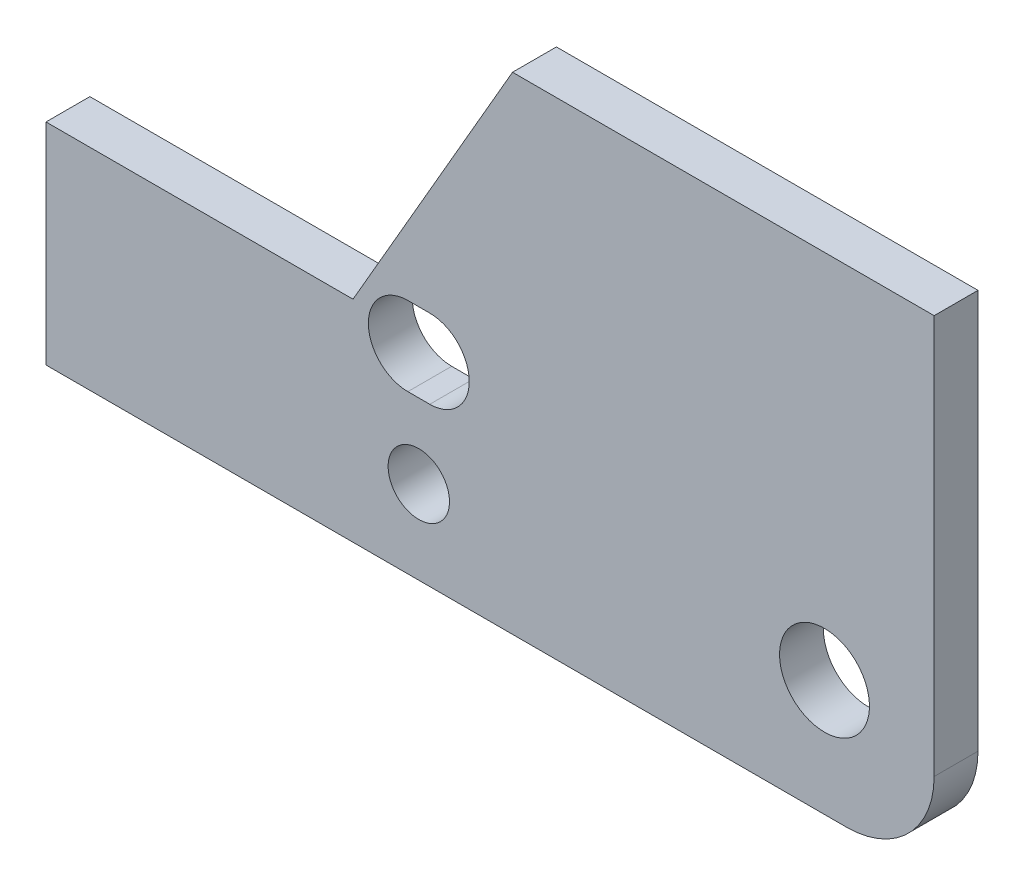
ISO-10303-21;
HEADER;
FILE_DESCRIPTION(('STEP AP214'),'2;1');
FILE_NAME('part.step','',(''),(''),'','','');
FILE_SCHEMA(('AUTOMOTIVE_DESIGN { 1 0 10303 214 1 1 1 1 }'));
ENDSEC;
DATA;
#1=APPLICATION_CONTEXT('core data for automotive mechanical design processes');
#2=APPLICATION_PROTOCOL_DEFINITION('international standard','automotive_design',2000,#1);
#3=PRODUCT_CONTEXT('',#1,'mechanical');
#4=PRODUCT('Part','Part','',(#3));
#5=PRODUCT_RELATED_PRODUCT_CATEGORY('part','',(#4));
#6=PRODUCT_DEFINITION_FORMATION('','',#4);
#7=PRODUCT_DEFINITION_CONTEXT('part definition',#1,'design');
#8=PRODUCT_DEFINITION('design','',#6,#7);
#9=PRODUCT_DEFINITION_SHAPE('','',#8);
#10=(LENGTH_UNIT() NAMED_UNIT(*) SI_UNIT(.MILLI.,.METRE.));
#11=(NAMED_UNIT(*) PLANE_ANGLE_UNIT() SI_UNIT($,.RADIAN.));
#12=(NAMED_UNIT(*) SI_UNIT($,.STERADIAN.) SOLID_ANGLE_UNIT());
#13=UNCERTAINTY_MEASURE_WITH_UNIT(LENGTH_MEASURE(1.E-05),#10,'distance_accuracy_value','');
#14=(GEOMETRIC_REPRESENTATION_CONTEXT(3) GLOBAL_UNCERTAINTY_ASSIGNED_CONTEXT((#13)) GLOBAL_UNIT_ASSIGNED_CONTEXT((#10,
#11,#12)) REPRESENTATION_CONTEXT('',''));
#15=CARTESIAN_POINT('',(0.,0.,0.));
#16=DIRECTION('',(0.,0.,1.));
#17=DIRECTION('',(1.,0.,0.));
#18=AXIS2_PLACEMENT_3D('',#15,#16,#17);
#19=CARTESIAN_POINT('',(17.5,7.2,0.));
#20=DIRECTION('',(0.,1.,0.));
#21=DIRECTION('',(-1.,0.,0.));
#22=AXIS2_PLACEMENT_3D('',#19,#20,#21);
#23=PLANE('',#22);
#24=DIRECTION('',(1.,0.,0.));
#25=VECTOR('',#24,1.);
#26=CARTESIAN_POINT('',(20.25,7.1999999928,2.));
#27=LINE('',#26,#25);
#28=CARTESIAN_POINT('',(16.5000000003462,7.1999999964,2.));
#29=VERTEX_POINT('',#28);
#30=CARTESIAN_POINT('',(17.5000000003462,7.1999999964,2.));
#31=VERTEX_POINT('',#30);
#32=EDGE_CURVE('E174',#29,#31,#27,.T.);
#33=ORIENTED_EDGE('',*,*,#32,.T.);
#34=DIRECTION('',(0.,0.,-1.));
#35=VECTOR('',#34,1.);
#36=CARTESIAN_POINT('',(17.5000000006924,7.2,1.));
#37=LINE('',#36,#35);
#38=CARTESIAN_POINT('',(17.5000000003462,7.2,0.));
#39=VERTEX_POINT('',#38);
#40=EDGE_CURVE('E142',#39,#31,#37,.F.);
#41=ORIENTED_EDGE('',*,*,#40,.F.);
#42=DIRECTION('',(-1.,0.,0.));
#43=VECTOR('',#42,1.);
#44=CARTESIAN_POINT('',(17.,7.2,0.));
#45=LINE('',#44,#43);
#46=CARTESIAN_POINT('',(16.5000000003462,7.2,0.));
#47=VERTEX_POINT('',#46);
#48=EDGE_CURVE('E135',#39,#47,#45,.T.);
#49=ORIENTED_EDGE('',*,*,#48,.T.);
#50=DIRECTION('',(0.,0.,1.));
#51=VECTOR('',#50,1.);
#52=CARTESIAN_POINT('',(16.5000000006924,7.2,1.));
#53=LINE('',#52,#51);
#54=EDGE_CURVE('E173',#29,#47,#53,.F.);
#55=ORIENTED_EDGE('',*,*,#54,.F.);
#56=EDGE_LOOP('',(#33,#41,#49,#55));
#57=FACE_BOUND('',#56,.T.);
#58=ADVANCED_FACE('F17',(#57),#23,.T.);
#59=CARTESIAN_POINT('',(36.5,0.,0.));
#60=DIRECTION('',(0.,1.,0.));
#61=DIRECTION('',(-1.,0.,0.));
#62=AXIS2_PLACEMENT_3D('',#59,#60,#61);
#63=PLANE('',#62);
#64=DIRECTION('',(0.,0.,-1.));
#65=VECTOR('',#64,1.);
#66=CARTESIAN_POINT('',(36.5000000015388,0.,1.));
#67=LINE('',#66,#65);
#68=CARTESIAN_POINT('',(36.5000000007694,0.,0.));
#69=VERTEX_POINT('',#68);
#70=CARTESIAN_POINT('',(36.5000000007694,0.,2.));
#71=VERTEX_POINT('',#70);
#72=EDGE_CURVE('E205',#69,#71,#67,.F.);
#73=ORIENTED_EDGE('',*,*,#72,.T.);
#74=DIRECTION('',(-1.,0.,0.));
#75=VECTOR('',#74,1.);
#76=CARTESIAN_POINT('',(20.25,0.,2.));
#77=LINE('',#76,#75);
#78=CARTESIAN_POINT('',(0.,0.,2.));
#79=VERTEX_POINT('',#78);
#80=EDGE_CURVE('E180',#71,#79,#77,.T.);
#81=ORIENTED_EDGE('',*,*,#80,.T.);
#82=DIRECTION('',(0.,0.,-1.));
#83=VECTOR('',#82,1.);
#84=CARTESIAN_POINT('',(0.,0.,1.));
#85=LINE('',#84,#83);
#86=CARTESIAN_POINT('',(0.,0.,0.));
#87=VERTEX_POINT('',#86);
#88=EDGE_CURVE('E118',#79,#87,#85,.T.);
#89=ORIENTED_EDGE('',*,*,#88,.T.);
#90=DIRECTION('',(-1.,0.,0.));
#91=VECTOR('',#90,1.);
#92=CARTESIAN_POINT('',(20.25,0.,0.));
#93=LINE('',#92,#91);
#94=EDGE_CURVE('E106',#69,#87,#93,.T.);
#95=ORIENTED_EDGE('',*,*,#94,.F.);
#96=EDGE_LOOP('',(#73,#81,#89,#95));
#97=FACE_BOUND('',#96,.T.);
#98=ADVANCED_FACE('F229',(#97),#63,.F.);
#99=CARTESIAN_POINT('',(0.,0.,2.));
#100=DIRECTION('',(1.,0.,0.));
#101=DIRECTION('',(0.,0.,-1.));
#102=AXIS2_PLACEMENT_3D('',#99,#100,#101);
#103=PLANE('',#102);
#104=ORIENTED_EDGE('',*,*,#88,.F.);
#105=DIRECTION('',(0.,1.,0.));
#106=VECTOR('',#105,1.);
#107=CARTESIAN_POINT('',(0.,11.1,2.));
#108=LINE('',#107,#106);
#109=CARTESIAN_POINT('',(0.,9.5999999936,2.));
#110=VERTEX_POINT('',#109);
#111=EDGE_CURVE('E117',#79,#110,#108,.T.);
#112=ORIENTED_EDGE('',*,*,#111,.T.);
#113=DIRECTION('',(0.,0.,-1.));
#114=VECTOR('',#113,1.);
#115=CARTESIAN_POINT('',(0.,9.6,1.));
#116=LINE('',#115,#114);
#117=CARTESIAN_POINT('',(0.,9.5999999936,0.));
#118=VERTEX_POINT('',#117);
#119=EDGE_CURVE('E96',#110,#118,#116,.T.);
#120=ORIENTED_EDGE('',*,*,#119,.T.);
#121=DIRECTION('',(0.,1.,0.));
#122=VECTOR('',#121,1.);
#123=CARTESIAN_POINT('',(0.,11.1,0.));
#124=LINE('',#123,#122);
#125=EDGE_CURVE('E109',#87,#118,#124,.T.);
#126=ORIENTED_EDGE('',*,*,#125,.F.);
#127=EDGE_LOOP('',(#104,#112,#120,#126));
#128=FACE_BOUND('',#127,.T.);
#129=ADVANCED_FACE('F115',(#128),#103,.F.);
#130=CARTESIAN_POINT('',(0.,9.6,2.));
#131=DIRECTION('',(0.,-1.,0.));
#132=DIRECTION('',(0.,0.,-1.));
#133=AXIS2_PLACEMENT_3D('',#130,#131,#132);
#134=PLANE('',#133);
#135=ORIENTED_EDGE('',*,*,#119,.F.);
#136=DIRECTION('',(1.,0.,0.));
#137=VECTOR('',#136,1.);
#138=CARTESIAN_POINT('',(20.25,9.5999999904,2.));
#139=LINE('',#138,#137);
#140=CARTESIAN_POINT('',(13.9999999972287,9.5999999952,2.));
#141=VERTEX_POINT('',#140);
#142=EDGE_CURVE('E141',#110,#141,#139,.T.);
#143=ORIENTED_EDGE('',*,*,#142,.T.);
#144=DIRECTION('',(0.,0.,-1.));
#145=VECTOR('',#144,1.);
#146=CARTESIAN_POINT('',(14.,9.6,1.));
#147=LINE('',#146,#145);
#148=CARTESIAN_POINT('',(13.9999999914142,9.59999999611555,0.));
#149=VERTEX_POINT('',#148);
#150=EDGE_CURVE('E87',#141,#149,#147,.T.);
#151=ORIENTED_EDGE('',*,*,#150,.T.);
#152=DIRECTION('',(1.,0.,0.));
#153=VECTOR('',#152,1.);
#154=CARTESIAN_POINT('',(20.25,9.5999999904,0.));
#155=LINE('',#154,#153);
#156=EDGE_CURVE('E111',#118,#149,#155,.T.);
#157=ORIENTED_EDGE('',*,*,#156,.F.);
#158=EDGE_LOOP('',(#135,#143,#151,#157));
#159=FACE_BOUND('',#158,.T.);
#160=ADVANCED_FACE('F120',(#159),#134,.F.);
#161=CARTESIAN_POINT('',(14.,9.6,0.));
#162=DIRECTION('',(0.866025403778167,-0.500000000010862,0.));
#163=DIRECTION('',(0.500000000010862,0.866025403778167,0.));
#164=AXIS2_PLACEMENT_3D('',#161,#162,#163);
#165=PLANE('',#164);
#166=ORIENTED_EDGE('',*,*,#150,.F.);
#167=DIRECTION('',(0.500000000010862,0.866025403778167,0.));
#168=VECTOR('',#167,1.);
#169=CARTESIAN_POINT('',(14.,9.6,2.));
#170=LINE('',#169,#168);
#171=CARTESIAN_POINT('',(21.274613392,22.2,2.));
#172=VERTEX_POINT('',#171);
#173=EDGE_CURVE('E21',#141,#172,#170,.T.);
#174=ORIENTED_EDGE('',*,*,#173,.T.);
#175=DIRECTION('',(0.,0.,-1.));
#176=VECTOR('',#175,1.);
#177=CARTESIAN_POINT('',(21.274613392,22.2,1.));
#178=LINE('',#177,#176);
#179=CARTESIAN_POINT('',(21.27461339,22.2,0.));
#180=VERTEX_POINT('',#179);
#181=EDGE_CURVE('E210',#172,#180,#178,.T.);
#182=ORIENTED_EDGE('',*,*,#181,.T.);
#183=DIRECTION('',(0.500000000240639,0.866025403645506,0.));
#184=VECTOR('',#183,1.);
#185=CARTESIAN_POINT('',(13.999999986,9.5999999904,0.));
#186=LINE('',#185,#184);
#187=EDGE_CURVE('E121',#149,#180,#186,.T.);
#188=ORIENTED_EDGE('',*,*,#187,.F.);
#189=EDGE_LOOP('',(#166,#174,#182,#188));
#190=FACE_BOUND('',#189,.T.);
#191=ADVANCED_FACE('F218',(#190),#165,.F.);
#192=CARTESIAN_POINT('',(21.274613392,22.2,2.));
#193=DIRECTION('',(0.,-1.,0.));
#194=DIRECTION('',(0.,0.,-1.));
#195=AXIS2_PLACEMENT_3D('',#192,#193,#194);
#196=PLANE('',#195);
#197=ORIENTED_EDGE('',*,*,#181,.F.);
#198=DIRECTION('',(1.,0.,0.));
#199=VECTOR('',#198,1.);
#200=CARTESIAN_POINT('',(20.25,22.2,2.));
#201=LINE('',#200,#199);
#202=CARTESIAN_POINT('',(40.5,22.2,2.));
#203=VERTEX_POINT('',#202);
#204=EDGE_CURVE('E145',#172,#203,#201,.T.);
#205=ORIENTED_EDGE('',*,*,#204,.T.);
#206=DIRECTION('',(0.,0.,-1.));
#207=VECTOR('',#206,1.);
#208=CARTESIAN_POINT('',(40.5,22.2,1.));
#209=LINE('',#208,#207);
#210=CARTESIAN_POINT('',(40.5,22.2,0.));
#211=VERTEX_POINT('',#210);
#212=EDGE_CURVE('E207',#203,#211,#209,.T.);
#213=ORIENTED_EDGE('',*,*,#212,.T.);
#214=DIRECTION('',(1.,0.,0.));
#215=VECTOR('',#214,1.);
#216=CARTESIAN_POINT('',(20.25,22.2,0.));
#217=LINE('',#216,#215);
#218=EDGE_CURVE('E123',#180,#211,#217,.T.);
#219=ORIENTED_EDGE('',*,*,#218,.F.);
#220=EDGE_LOOP('',(#197,#205,#213,#219));
#221=FACE_BOUND('',#220,.T.);
#222=ADVANCED_FACE('F221',(#221),#196,.F.);
#223=CARTESIAN_POINT('',(40.5,22.2,0.));
#224=DIRECTION('',(-1.,0.,0.));
#225=DIRECTION('',(0.,-1.,0.));
#226=AXIS2_PLACEMENT_3D('',#223,#224,#225);
#227=PLANE('',#226);
#228=ORIENTED_EDGE('',*,*,#212,.F.);
#229=DIRECTION('',(0.,-1.,0.));
#230=VECTOR('',#229,1.);
#231=CARTESIAN_POINT('',(40.5,11.1,2.));
#232=LINE('',#231,#230);
#233=CARTESIAN_POINT('',(40.5,3.99999999917959,2.));
#234=VERTEX_POINT('',#233);
#235=EDGE_CURVE('E148',#203,#234,#232,.T.);
#236=ORIENTED_EDGE('',*,*,#235,.T.);
#237=DIRECTION('',(0.,0.,1.));
#238=VECTOR('',#237,1.);
#239=CARTESIAN_POINT('',(40.5,3.99999999835917,1.));
#240=LINE('',#239,#238);
#241=CARTESIAN_POINT('',(40.5,3.99999999917959,0.));
#242=VERTEX_POINT('',#241);
#243=EDGE_CURVE('E202',#234,#242,#240,.F.);
#244=ORIENTED_EDGE('',*,*,#243,.T.);
#245=DIRECTION('',(0.,-1.,0.));
#246=VECTOR('',#245,1.);
#247=CARTESIAN_POINT('',(40.5,11.1,0.));
#248=LINE('',#247,#246);
#249=EDGE_CURVE('E168',#211,#242,#248,.T.);
#250=ORIENTED_EDGE('',*,*,#249,.F.);
#251=EDGE_LOOP('',(#228,#236,#244,#250));
#252=FACE_BOUND('',#251,.T.);
#253=ADVANCED_FACE('F224',(#252),#227,.F.);
#254=CARTESIAN_POINT('',(36.5,4.,2.));
#255=DIRECTION('',(0.,0.,-1.));
#256=DIRECTION('',(-1.,0.,0.));
#257=AXIS2_PLACEMENT_3D('',#254,#255,#256);
#258=CYLINDRICAL_SURFACE('',#257,4.);
#259=ORIENTED_EDGE('',*,*,#243,.F.);
#260=CARTESIAN_POINT('',(36.5,4.,2.));
#261=DIRECTION('',(0.,0.,-1.));
#262=DIRECTION('',(-1.,0.,0.));
#263=AXIS2_PLACEMENT_3D('',#260,#261,#262);
#264=CIRCLE('',#263,4.);
#265=EDGE_CURVE('E181',#234,#71,#264,.T.);
#266=ORIENTED_EDGE('',*,*,#265,.T.);
#267=ORIENTED_EDGE('',*,*,#72,.F.);
#268=CARTESIAN_POINT('',(36.5,4.,0.));
#269=DIRECTION('',(0.,0.,-1.));
#270=DIRECTION('',(-1.,0.,0.));
#271=AXIS2_PLACEMENT_3D('',#268,#269,#270);
#272=CIRCLE('',#271,4.);
#273=EDGE_CURVE('E167',#242,#69,#272,.T.);
#274=ORIENTED_EDGE('',*,*,#273,.F.);
#275=EDGE_LOOP('',(#259,#266,#267,#274));
#276=FACE_BOUND('',#275,.T.);
#277=ADVANCED_FACE('F231',(#276),#258,.T.);
#278=CARTESIAN_POINT('',(17.,3.8,2.));
#279=DIRECTION('',(0.,0.,-1.));
#280=DIRECTION('',(-1.,0.,0.));
#281=AXIS2_PLACEMENT_3D('',#278,#279,#280);
#282=CYLINDRICAL_SURFACE('',#281,1.4);
#283=CARTESIAN_POINT('',(17.,3.8,2.));
#284=DIRECTION('',(0.,0.,-1.));
#285=DIRECTION('',(-1.,0.,0.));
#286=AXIS2_PLACEMENT_3D('',#283,#284,#285);
#287=CIRCLE('',#286,1.4);
#288=CARTESIAN_POINT('',(15.6,3.8,2.));
#289=VERTEX_POINT('',#288);
#290=EDGE_CURVE('E178',#289,#289,#287,.F.);
#291=ORIENTED_EDGE('',*,*,#290,.T.);
#292=EDGE_LOOP('',(#291));
#293=FACE_BOUND('',#292,.T.);
#294=CARTESIAN_POINT('',(17.,3.8,0.));
#295=DIRECTION('',(0.,0.,-1.));
#296=DIRECTION('',(-1.,0.,0.));
#297=AXIS2_PLACEMENT_3D('',#294,#295,#296);
#298=CIRCLE('',#297,1.4);
#299=CARTESIAN_POINT('',(15.6,3.8,0.));
#300=VERTEX_POINT('',#299);
#301=EDGE_CURVE('E164',#300,#300,#298,.F.);
#302=ORIENTED_EDGE('',*,*,#301,.F.);
#303=EDGE_LOOP('',(#302));
#304=FACE_BOUND('',#303,.T.);
#305=ADVANCED_FACE('F233',(#293,#304),#282,.F.);
#306=CARTESIAN_POINT('',(35.5,5.3,2.));
#307=DIRECTION('',(0.,0.,-1.));
#308=DIRECTION('',(-1.,0.,0.));
#309=AXIS2_PLACEMENT_3D('',#306,#307,#308);
#310=CYLINDRICAL_SURFACE('',#309,2.05000000000001);
#311=CARTESIAN_POINT('',(35.5,5.3,2.));
#312=DIRECTION('',(0.,0.,-1.));
#313=DIRECTION('',(-1.,0.,0.));
#314=AXIS2_PLACEMENT_3D('',#311,#312,#313);
#315=CIRCLE('',#314,2.05000000000001);
#316=CARTESIAN_POINT('',(33.45,5.3,2.));
#317=VERTEX_POINT('',#316);
#318=EDGE_CURVE('E175',#317,#317,#315,.F.);
#319=ORIENTED_EDGE('',*,*,#318,.T.);
#320=EDGE_LOOP('',(#319));
#321=FACE_BOUND('',#320,.T.);
#322=CARTESIAN_POINT('',(35.5,5.3,0.));
#323=DIRECTION('',(0.,0.,-1.));
#324=DIRECTION('',(-1.,0.,0.));
#325=AXIS2_PLACEMENT_3D('',#322,#323,#324);
#326=CIRCLE('',#325,2.05000000000001);
#327=CARTESIAN_POINT('',(33.45,5.3,0.));
#328=VERTEX_POINT('',#327);
#329=EDGE_CURVE('E161',#328,#328,#326,.F.);
#330=ORIENTED_EDGE('',*,*,#329,.F.);
#331=EDGE_LOOP('',(#330));
#332=FACE_BOUND('',#331,.T.);
#333=ADVANCED_FACE('F240',(#321,#332),#310,.F.);
#334=CARTESIAN_POINT('',(17.5,9.,2.));
#335=DIRECTION('',(0.,0.,-1.));
#336=DIRECTION('',(-1.,0.,0.));
#337=AXIS2_PLACEMENT_3D('',#334,#335,#336);
#338=CYLINDRICAL_SURFACE('',#337,1.8);
#339=CARTESIAN_POINT('',(17.5,9.,2.));
#340=DIRECTION('',(0.,0.,-1.));
#341=DIRECTION('',(-1.,0.,0.));
#342=AXIS2_PLACEMENT_3D('',#339,#340,#341);
#343=CIRCLE('',#342,1.8);
#344=CARTESIAN_POINT('',(17.5,10.8,2.));
#345=VERTEX_POINT('',#344);
#346=EDGE_CURVE('E170',#31,#345,#343,.F.);
#347=ORIENTED_EDGE('',*,*,#346,.T.);
#348=DIRECTION('',(0.,0.,1.));
#349=VECTOR('',#348,1.);
#350=CARTESIAN_POINT('',(17.5,10.8,1.));
#351=LINE('',#350,#349);
#352=CARTESIAN_POINT('',(17.5,10.8,0.));
#353=VERTEX_POINT('',#352);
#354=EDGE_CURVE('E199',#353,#345,#351,.T.);
#355=ORIENTED_EDGE('',*,*,#354,.F.);
#356=CARTESIAN_POINT('',(17.5,9.,0.));
#357=DIRECTION('',(0.,0.,-1.));
#358=DIRECTION('',(-1.,0.,0.));
#359=AXIS2_PLACEMENT_3D('',#356,#357,#358);
#360=CIRCLE('',#359,1.8);
#361=EDGE_CURVE('E158',#39,#353,#360,.F.);
#362=ORIENTED_EDGE('',*,*,#361,.F.);
#363=ORIENTED_EDGE('',*,*,#40,.T.);
#364=EDGE_LOOP('',(#347,#355,#362,#363));
#365=FACE_BOUND('',#364,.T.);
#366=ADVANCED_FACE('F253',(#365),#338,.F.);
#367=CARTESIAN_POINT('',(40.5,0.,2.));
#368=DIRECTION('',(0.,0.,-1.));
#369=DIRECTION('',(-1.,0.,0.));
#370=AXIS2_PLACEMENT_3D('',#367,#368,#369);
#371=PLANE('',#370);
#372=DIRECTION('',(-1.,0.,0.));
#373=VECTOR('',#372,1.);
#374=CARTESIAN_POINT('',(17.,10.8,2.));
#375=LINE('',#374,#373);
#376=CARTESIAN_POINT('',(16.5000000001846,10.8,2.));
#377=VERTEX_POINT('',#376);
#378=EDGE_CURVE('E157',#345,#377,#375,.T.);
#379=ORIENTED_EDGE('',*,*,#378,.F.);
#380=ORIENTED_EDGE('',*,*,#346,.F.);
#381=ORIENTED_EDGE('',*,*,#32,.F.);
#382=CARTESIAN_POINT('',(16.5,9.,2.));
#383=DIRECTION('',(0.,0.,-1.));
#384=DIRECTION('',(-1.,0.,0.));
#385=AXIS2_PLACEMENT_3D('',#382,#383,#384);
#386=CIRCLE('',#385,1.8);
#387=EDGE_CURVE('E155',#377,#29,#386,.F.);
#388=ORIENTED_EDGE('',*,*,#387,.F.);
#389=EDGE_LOOP('',(#379,#380,#381,#388));
#390=FACE_BOUND('',#389,.T.);
#391=ORIENTED_EDGE('',*,*,#318,.F.);
#392=EDGE_LOOP('',(#391));
#393=FACE_BOUND('',#392,.T.);
#394=ORIENTED_EDGE('',*,*,#290,.F.);
#395=EDGE_LOOP('',(#394));
#396=FACE_BOUND('',#395,.T.);
#397=ORIENTED_EDGE('',*,*,#265,.F.);
#398=ORIENTED_EDGE('',*,*,#235,.F.);
#399=ORIENTED_EDGE('',*,*,#204,.F.);
#400=ORIENTED_EDGE('',*,*,#173,.F.);
#401=ORIENTED_EDGE('',*,*,#142,.F.);
#402=ORIENTED_EDGE('',*,*,#111,.F.);
#403=ORIENTED_EDGE('',*,*,#80,.F.);
#404=EDGE_LOOP('',(#397,#398,#399,#400,#401,#402,#403));
#405=FACE_BOUND('',#404,.T.);
#406=ADVANCED_FACE('F226',(#390,#393,#396,#405),#371,.F.);
#407=CARTESIAN_POINT('',(40.5,0.,0.));
#408=DIRECTION('',(0.,0.,-1.));
#409=DIRECTION('',(-1.,0.,0.));
#410=AXIS2_PLACEMENT_3D('',#407,#408,#409);
#411=PLANE('',#410);
#412=ORIENTED_EDGE('',*,*,#48,.F.);
#413=ORIENTED_EDGE('',*,*,#361,.T.);
#414=DIRECTION('',(1.,0.,0.));
#415=VECTOR('',#414,1.);
#416=CARTESIAN_POINT('',(17.,10.8,0.));
#417=LINE('',#416,#415);
#418=CARTESIAN_POINT('',(16.5000000001846,10.8,0.));
#419=VERTEX_POINT('',#418);
#420=EDGE_CURVE('E160',#419,#353,#417,.T.);
#421=ORIENTED_EDGE('',*,*,#420,.F.);
#422=CARTESIAN_POINT('',(16.5,9.,0.));
#423=DIRECTION('',(0.,0.,-1.));
#424=DIRECTION('',(-1.,0.,0.));
#425=AXIS2_PLACEMENT_3D('',#422,#423,#424);
#426=CIRCLE('',#425,1.8);
#427=EDGE_CURVE('E27',#47,#419,#426,.T.);
#428=ORIENTED_EDGE('',*,*,#427,.F.);
#429=EDGE_LOOP('',(#412,#413,#421,#428));
#430=FACE_BOUND('',#429,.T.);
#431=ORIENTED_EDGE('',*,*,#329,.T.);
#432=EDGE_LOOP('',(#431));
#433=FACE_BOUND('',#432,.T.);
#434=ORIENTED_EDGE('',*,*,#301,.T.);
#435=EDGE_LOOP('',(#434));
#436=FACE_BOUND('',#435,.T.);
#437=ORIENTED_EDGE('',*,*,#249,.T.);
#438=ORIENTED_EDGE('',*,*,#273,.T.);
#439=ORIENTED_EDGE('',*,*,#94,.T.);
#440=ORIENTED_EDGE('',*,*,#125,.T.);
#441=ORIENTED_EDGE('',*,*,#156,.T.);
#442=ORIENTED_EDGE('',*,*,#187,.T.);
#443=ORIENTED_EDGE('',*,*,#218,.T.);
#444=EDGE_LOOP('',(#437,#438,#439,#440,#441,#442,#443));
#445=FACE_BOUND('',#444,.T.);
#446=ADVANCED_FACE('F110',(#430,#433,#436,#445),#411,.T.);
#447=CARTESIAN_POINT('',(16.5,10.8,0.));
#448=DIRECTION('',(0.,-1.,0.));
#449=DIRECTION('',(1.,0.,0.));
#450=AXIS2_PLACEMENT_3D('',#447,#448,#449);
#451=PLANE('',#450);
#452=ORIENTED_EDGE('',*,*,#378,.T.);
#453=DIRECTION('',(0.,0.,-1.));
#454=VECTOR('',#453,1.);
#455=CARTESIAN_POINT('',(16.5000000003692,10.8,1.));
#456=LINE('',#455,#454);
#457=EDGE_CURVE('E11',#419,#377,#456,.F.);
#458=ORIENTED_EDGE('',*,*,#457,.F.);
#459=ORIENTED_EDGE('',*,*,#420,.T.);
#460=ORIENTED_EDGE('',*,*,#354,.T.);
#461=EDGE_LOOP('',(#452,#458,#459,#460));
#462=FACE_BOUND('',#461,.T.);
#463=ADVANCED_FACE('F19',(#462),#451,.T.);
#464=CARTESIAN_POINT('',(16.5,9.,2.));
#465=DIRECTION('',(0.,0.,-1.));
#466=DIRECTION('',(-1.,0.,0.));
#467=AXIS2_PLACEMENT_3D('',#464,#465,#466);
#468=CYLINDRICAL_SURFACE('',#467,1.8);
#469=ORIENTED_EDGE('',*,*,#427,.T.);
#470=ORIENTED_EDGE('',*,*,#457,.T.);
#471=ORIENTED_EDGE('',*,*,#387,.T.);
#472=ORIENTED_EDGE('',*,*,#54,.T.);
#473=EDGE_LOOP('',(#469,#470,#471,#472));
#474=FACE_BOUND('',#473,.T.);
#475=ADVANCED_FACE('F245',(#474),#468,.F.);
#476=CLOSED_SHELL('',(#58,#98,#129,#160,#191,#222,#253,#277,#305,#333,#366,#406,#446,#463,#475));
#477=MANIFOLD_SOLID_BREP('B1',#476);
#478=ADVANCED_BREP_SHAPE_REPRESENTATION('',(#18,#477),#14);
#479=SHAPE_DEFINITION_REPRESENTATION(#9,#478);
ENDSEC;
END-ISO-10303-21;
